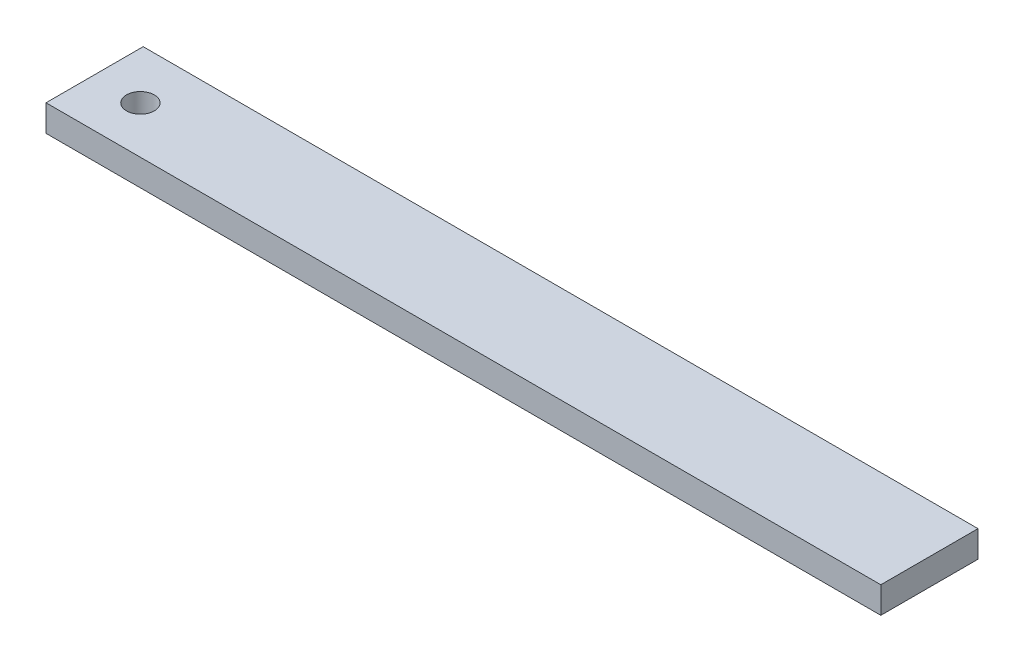
ISO-10303-21;
HEADER;
FILE_DESCRIPTION(('STEP AP214'),'2;1');
FILE_NAME('part.step','',(''),(''),'','','');
FILE_SCHEMA(('AUTOMOTIVE_DESIGN { 1 0 10303 214 1 1 1 1 }'));
ENDSEC;
DATA;
#1=APPLICATION_CONTEXT('core data for automotive mechanical design processes');
#2=APPLICATION_PROTOCOL_DEFINITION('international standard','automotive_design',2000,#1);
#3=PRODUCT_CONTEXT('',#1,'mechanical');
#4=PRODUCT('Part','Part','',(#3));
#5=PRODUCT_RELATED_PRODUCT_CATEGORY('part','',(#4));
#6=PRODUCT_DEFINITION_FORMATION('','',#4);
#7=PRODUCT_DEFINITION_CONTEXT('part definition',#1,'design');
#8=PRODUCT_DEFINITION('design','',#6,#7);
#9=PRODUCT_DEFINITION_SHAPE('','',#8);
#10=(LENGTH_UNIT() NAMED_UNIT(*) SI_UNIT(.MILLI.,.METRE.));
#11=(NAMED_UNIT(*) PLANE_ANGLE_UNIT() SI_UNIT($,.RADIAN.));
#12=(NAMED_UNIT(*) SI_UNIT($,.STERADIAN.) SOLID_ANGLE_UNIT());
#13=UNCERTAINTY_MEASURE_WITH_UNIT(LENGTH_MEASURE(1.E-05),#10,'distance_accuracy_value','');
#14=(GEOMETRIC_REPRESENTATION_CONTEXT(3) GLOBAL_UNCERTAINTY_ASSIGNED_CONTEXT((#13)) GLOBAL_UNIT_ASSIGNED_CONTEXT((#10,
#11,#12)) REPRESENTATION_CONTEXT('',''));
#15=CARTESIAN_POINT('',(0.,0.,0.));
#16=DIRECTION('',(0.,0.,1.));
#17=DIRECTION('',(1.,0.,0.));
#18=AXIS2_PLACEMENT_3D('',#15,#16,#17);
#19=CARTESIAN_POINT('',(0.,9.525,0.));
#20=DIRECTION('',(0.,1.,0.));
#21=DIRECTION('',(0.,0.,1.));
#22=AXIS2_PLACEMENT_3D('',#19,#20,#21);
#23=PLANE('',#22);
#24=DIRECTION('',(0.,0.,-1.));
#25=VECTOR('',#24,1.);
#26=CARTESIAN_POINT('',(0.,9.525,0.));
#27=LINE('',#26,#25);
#28=CARTESIAN_POINT('',(0.,9.525,0.));
#29=VERTEX_POINT('',#28);
#30=CARTESIAN_POINT('',(0.,9.525,-34.925));
#31=VERTEX_POINT('',#30);
#32=EDGE_CURVE('E88',#29,#31,#27,.T.);
#33=ORIENTED_EDGE('',*,*,#32,.T.);
#34=DIRECTION('',(-1.,0.,0.));
#35=VECTOR('',#34,1.);
#36=CARTESIAN_POINT('',(0.,9.525,-34.925));
#37=LINE('',#36,#35);
#38=CARTESIAN_POINT('',(-300.,9.525,-34.925));
#39=VERTEX_POINT('',#38);
#40=EDGE_CURVE('E83',#31,#39,#37,.T.);
#41=ORIENTED_EDGE('',*,*,#40,.T.);
#42=DIRECTION('',(0.,0.,1.));
#43=VECTOR('',#42,1.);
#44=CARTESIAN_POINT('',(-300.,9.525,0.));
#45=LINE('',#44,#43);
#46=CARTESIAN_POINT('',(-300.,9.525,0.));
#47=VERTEX_POINT('',#46);
#48=EDGE_CURVE('E86',#39,#47,#45,.T.);
#49=ORIENTED_EDGE('',*,*,#48,.T.);
#50=DIRECTION('',(1.,0.,0.));
#51=VECTOR('',#50,1.);
#52=CARTESIAN_POINT('',(0.,9.525,0.));
#53=LINE('',#52,#51);
#54=EDGE_CURVE('E53',#47,#29,#53,.T.);
#55=ORIENTED_EDGE('',*,*,#54,.T.);
#56=EDGE_LOOP('',(#33,#41,#49,#55));
#57=FACE_BOUND('',#56,.T.);
#58=CARTESIAN_POINT('',(-283.,9.525,-16.925));
#59=DIRECTION('',(0.,1.,0.));
#60=DIRECTION('',(0.,0.,1.));
#61=AXIS2_PLACEMENT_3D('',#58,#59,#60);
#62=CIRCLE('',#61,4.99999999999999);
#63=CARTESIAN_POINT('',(-283.,9.525,-21.925));
#64=VERTEX_POINT('',#63);
#65=EDGE_CURVE('E103',#64,#64,#62,.T.);
#66=ORIENTED_EDGE('',*,*,#65,.F.);
#67=EDGE_LOOP('',(#66));
#68=FACE_BOUND('',#67,.T.);
#69=ADVANCED_FACE('F36',(#57,#68),#23,.T.);
#70=CARTESIAN_POINT('',(0.,0.,0.));
#71=DIRECTION('',(0.,1.,0.));
#72=DIRECTION('',(0.,0.,1.));
#73=AXIS2_PLACEMENT_3D('',#70,#71,#72);
#74=PLANE('',#73);
#75=DIRECTION('',(0.,0.,-1.));
#76=VECTOR('',#75,1.);
#77=CARTESIAN_POINT('',(0.,0.,0.));
#78=LINE('',#77,#76);
#79=CARTESIAN_POINT('',(0.,0.,0.));
#80=VERTEX_POINT('',#79);
#81=CARTESIAN_POINT('',(0.,0.,-34.925));
#82=VERTEX_POINT('',#81);
#83=EDGE_CURVE('E100',#80,#82,#78,.T.);
#84=ORIENTED_EDGE('',*,*,#83,.F.);
#85=DIRECTION('',(1.,0.,0.));
#86=VECTOR('',#85,1.);
#87=CARTESIAN_POINT('',(0.,0.,0.));
#88=LINE('',#87,#86);
#89=CARTESIAN_POINT('',(-300.,0.,0.));
#90=VERTEX_POINT('',#89);
#91=EDGE_CURVE('E76',#90,#80,#88,.T.);
#92=ORIENTED_EDGE('',*,*,#91,.F.);
#93=DIRECTION('',(0.,0.,1.));
#94=VECTOR('',#93,1.);
#95=CARTESIAN_POINT('',(-300.,0.,0.));
#96=LINE('',#95,#94);
#97=CARTESIAN_POINT('',(-300.,0.,-34.925));
#98=VERTEX_POINT('',#97);
#99=EDGE_CURVE('E70',#98,#90,#96,.T.);
#100=ORIENTED_EDGE('',*,*,#99,.F.);
#101=DIRECTION('',(-1.,0.,0.));
#102=VECTOR('',#101,1.);
#103=CARTESIAN_POINT('',(0.,0.,-34.925));
#104=LINE('',#103,#102);
#105=EDGE_CURVE('E92',#82,#98,#104,.T.);
#106=ORIENTED_EDGE('',*,*,#105,.F.);
#107=EDGE_LOOP('',(#84,#92,#100,#106));
#108=FACE_BOUND('',#107,.T.);
#109=CARTESIAN_POINT('',(-283.,0.,-16.925));
#110=DIRECTION('',(0.,1.,0.));
#111=DIRECTION('',(0.,0.,1.));
#112=AXIS2_PLACEMENT_3D('',#109,#110,#111);
#113=CIRCLE('',#112,4.99999999999999);
#114=CARTESIAN_POINT('',(-283.,0.,-21.925));
#115=VERTEX_POINT('',#114);
#116=EDGE_CURVE('E115',#115,#115,#113,.T.);
#117=ORIENTED_EDGE('',*,*,#116,.T.);
#118=EDGE_LOOP('',(#117));
#119=FACE_BOUND('',#118,.T.);
#120=ADVANCED_FACE('F111',(#108,#119),#74,.F.);
#121=CARTESIAN_POINT('',(0.,9.525,0.));
#122=DIRECTION('',(-1.,0.,0.));
#123=DIRECTION('',(0.,0.,1.));
#124=AXIS2_PLACEMENT_3D('',#121,#122,#123);
#125=PLANE('',#124);
#126=ORIENTED_EDGE('',*,*,#83,.T.);
#127=DIRECTION('',(0.,-1.,0.));
#128=VECTOR('',#127,1.);
#129=CARTESIAN_POINT('',(0.,9.525,-34.925));
#130=LINE('',#129,#128);
#131=EDGE_CURVE('E11',#31,#82,#130,.T.);
#132=ORIENTED_EDGE('',*,*,#131,.F.);
#133=ORIENTED_EDGE('',*,*,#32,.F.);
#134=DIRECTION('',(0.,-1.,0.));
#135=VECTOR('',#134,1.);
#136=CARTESIAN_POINT('',(0.,9.525,0.));
#137=LINE('',#136,#135);
#138=EDGE_CURVE('E96',#29,#80,#137,.T.);
#139=ORIENTED_EDGE('',*,*,#138,.T.);
#140=EDGE_LOOP('',(#126,#132,#133,#139));
#141=FACE_BOUND('',#140,.T.);
#142=ADVANCED_FACE('F38',(#141),#125,.F.);
#143=CARTESIAN_POINT('',(0.,9.525,-34.925));
#144=DIRECTION('',(0.,0.,1.));
#145=DIRECTION('',(1.,0.,0.));
#146=AXIS2_PLACEMENT_3D('',#143,#144,#145);
#147=PLANE('',#146);
#148=ORIENTED_EDGE('',*,*,#105,.T.);
#149=DIRECTION('',(0.,-1.,0.));
#150=VECTOR('',#149,1.);
#151=CARTESIAN_POINT('',(-300.,9.525,-34.925));
#152=LINE('',#151,#150);
#153=EDGE_CURVE('E45',#39,#98,#152,.T.);
#154=ORIENTED_EDGE('',*,*,#153,.F.);
#155=ORIENTED_EDGE('',*,*,#40,.F.);
#156=ORIENTED_EDGE('',*,*,#131,.T.);
#157=EDGE_LOOP('',(#148,#154,#155,#156));
#158=FACE_BOUND('',#157,.T.);
#159=ADVANCED_FACE('F91',(#158),#147,.F.);
#160=CARTESIAN_POINT('',(-300.,9.525,0.));
#161=DIRECTION('',(1.,0.,0.));
#162=DIRECTION('',(0.,0.,-1.));
#163=AXIS2_PLACEMENT_3D('',#160,#161,#162);
#164=PLANE('',#163);
#165=ORIENTED_EDGE('',*,*,#99,.T.);
#166=DIRECTION('',(0.,-1.,0.));
#167=VECTOR('',#166,1.);
#168=CARTESIAN_POINT('',(-300.,9.525,0.));
#169=LINE('',#168,#167);
#170=EDGE_CURVE('E93',#47,#90,#169,.T.);
#171=ORIENTED_EDGE('',*,*,#170,.F.);
#172=ORIENTED_EDGE('',*,*,#48,.F.);
#173=ORIENTED_EDGE('',*,*,#153,.T.);
#174=EDGE_LOOP('',(#165,#171,#172,#173));
#175=FACE_BOUND('',#174,.T.);
#176=ADVANCED_FACE('F94',(#175),#164,.F.);
#177=CARTESIAN_POINT('',(0.,9.525,0.));
#178=DIRECTION('',(0.,0.,-1.));
#179=DIRECTION('',(-1.,0.,0.));
#180=AXIS2_PLACEMENT_3D('',#177,#178,#179);
#181=PLANE('',#180);
#182=ORIENTED_EDGE('',*,*,#91,.T.);
#183=ORIENTED_EDGE('',*,*,#138,.F.);
#184=ORIENTED_EDGE('',*,*,#54,.F.);
#185=ORIENTED_EDGE('',*,*,#170,.T.);
#186=EDGE_LOOP('',(#182,#183,#184,#185));
#187=FACE_BOUND('',#186,.T.);
#188=ADVANCED_FACE('F108',(#187),#181,.F.);
#189=CARTESIAN_POINT('',(-283.,9.525,-16.925));
#190=DIRECTION('',(0.,-1.,0.));
#191=DIRECTION('',(0.,0.,-1.));
#192=AXIS2_PLACEMENT_3D('',#189,#190,#191);
#193=CYLINDRICAL_SURFACE('',#192,4.99999999999999);
#194=CARTESIAN_POINT('',(-283.,9.525,-21.925));
#195=CARTESIAN_POINT('',(-283.,9.42578125,-21.925));
#196=CARTESIAN_POINT('',(-283.,9.3265625,-21.925));
#197=CARTESIAN_POINT('',(-283.,9.128125,-21.925));
#198=CARTESIAN_POINT('',(-283.,9.02890625,-21.925));
#199=CARTESIAN_POINT('',(-283.,8.83046875,-21.925));
#200=CARTESIAN_POINT('',(-283.,8.73125,-21.925));
#201=CARTESIAN_POINT('',(-283.,8.5328125,-21.925));
#202=CARTESIAN_POINT('',(-283.,8.43359375,-21.925));
#203=CARTESIAN_POINT('',(-283.,8.23515625,-21.925));
#204=CARTESIAN_POINT('',(-283.,8.1359375,-21.925));
#205=CARTESIAN_POINT('',(-283.,7.9375,-21.925));
#206=CARTESIAN_POINT('',(-283.,7.83828125,-21.925));
#207=CARTESIAN_POINT('',(-283.,7.63984375,-21.925));
#208=CARTESIAN_POINT('',(-283.,7.540625,-21.925));
#209=CARTESIAN_POINT('',(-283.,7.3421875,-21.925));
#210=CARTESIAN_POINT('',(-283.,7.24296875,-21.925));
#211=CARTESIAN_POINT('',(-283.,7.04453125,-21.925));
#212=CARTESIAN_POINT('',(-283.,6.9453125,-21.925));
#213=CARTESIAN_POINT('',(-283.,6.746875,-21.925));
#214=CARTESIAN_POINT('',(-283.,6.64765625,-21.925));
#215=CARTESIAN_POINT('',(-283.,6.44921875,-21.925));
#216=CARTESIAN_POINT('',(-283.,6.35,-21.925));
#217=CARTESIAN_POINT('',(-283.,6.1515625,-21.925));
#218=CARTESIAN_POINT('',(-283.,6.05234375,-21.925));
#219=CARTESIAN_POINT('',(-283.,5.85390625,-21.925));
#220=CARTESIAN_POINT('',(-283.,5.7546875,-21.925));
#221=CARTESIAN_POINT('',(-283.,5.55625,-21.925));
#222=CARTESIAN_POINT('',(-283.,5.45703125,-21.925));
#223=CARTESIAN_POINT('',(-283.,5.25859375,-21.925));
#224=CARTESIAN_POINT('',(-283.,5.159375,-21.925));
#225=CARTESIAN_POINT('',(-283.,4.9609375,-21.925));
#226=CARTESIAN_POINT('',(-283.,4.86171875,-21.925));
#227=CARTESIAN_POINT('',(-283.,4.66328125,-21.925));
#228=CARTESIAN_POINT('',(-283.,4.5640625,-21.925));
#229=CARTESIAN_POINT('',(-283.,4.365625,-21.925));
#230=CARTESIAN_POINT('',(-283.,4.26640625,-21.925));
#231=CARTESIAN_POINT('',(-283.,4.06796875,-21.925));
#232=CARTESIAN_POINT('',(-283.,3.96875,-21.925));
#233=CARTESIAN_POINT('',(-283.,3.7703125,-21.925));
#234=CARTESIAN_POINT('',(-283.,3.67109375,-21.925));
#235=CARTESIAN_POINT('',(-283.,3.47265625,-21.925));
#236=CARTESIAN_POINT('',(-283.,3.3734375,-21.925));
#237=CARTESIAN_POINT('',(-283.,3.175,-21.925));
#238=CARTESIAN_POINT('',(-283.,3.07578125,-21.925));
#239=CARTESIAN_POINT('',(-283.,2.87734375,-21.925));
#240=CARTESIAN_POINT('',(-283.,2.778125,-21.925));
#241=CARTESIAN_POINT('',(-283.,2.5796875,-21.925));
#242=CARTESIAN_POINT('',(-283.,2.48046875,-21.925));
#243=CARTESIAN_POINT('',(-283.,2.28203125,-21.925));
#244=CARTESIAN_POINT('',(-283.,2.1828125,-21.925));
#245=CARTESIAN_POINT('',(-283.,1.984375,-21.925));
#246=CARTESIAN_POINT('',(-283.,1.88515625,-21.925));
#247=CARTESIAN_POINT('',(-283.,1.68671875,-21.925));
#248=CARTESIAN_POINT('',(-283.,1.5875,-21.925));
#249=CARTESIAN_POINT('',(-283.,1.3890625,-21.925));
#250=CARTESIAN_POINT('',(-283.,1.28984375,-21.925));
#251=CARTESIAN_POINT('',(-283.,1.09140625,-21.925));
#252=CARTESIAN_POINT('',(-283.,0.992187500000001,-21.925));
#253=CARTESIAN_POINT('',(-283.,0.793750000000001,-21.925));
#254=CARTESIAN_POINT('',(-283.,0.69453125,-21.925));
#255=CARTESIAN_POINT('',(-283.,0.49609375,-21.925));
#256=CARTESIAN_POINT('',(-283.,0.396875,-21.925));
#257=CARTESIAN_POINT('',(-283.,0.1984375,-21.925));
#258=CARTESIAN_POINT('',(-283.,0.0992187500000001,-21.925));
#259=CARTESIAN_POINT('',(-283.,0.,-21.925));
#260=B_SPLINE_CURVE_WITH_KNOTS('',3,(#194,#195,#196,#197,#198,#199,#200,#201,#202,#203,#204,
#205,#206,#207,#208,#209,#210,#211,#212,#213,#214,#215,#216,#217,#218,#219,#220,#221,#222,#223,
#224,#225,#226,#227,#228,#229,#230,#231,#232,#233,#234,#235,#236,#237,#238,#239,#240,#241,#242,
#243,#244,#245,#246,#247,#248,#249,#250,#251,#252,#253,#254,#255,#256,#257,#258,#259),
.UNSPECIFIED.,.F.,.F.,(4,2,2,2,2,2,2,2,2,2,2,2,2,2,2,2,2,2,2,2,2,2,2,2,2,2,2,2,2,2,2,2,4),(0.,
0.29765625,0.5953125,0.892968750000001,1.190625,1.48828125,1.7859375,2.08359375,2.38125,
2.67890625,2.9765625,3.27421875,3.571875,3.86953125,4.1671875,4.46484375,4.7625,5.06015625,
5.3578125,5.65546875,5.953125,6.25078125,6.5484375,6.84609375,7.14375,7.44140625,7.7390625,
8.03671875,8.334375,8.63203125,8.9296875,9.22734375,9.525),.UNSPECIFIED.);
#261=EDGE_CURVE('BSEAM121',#64,#115,#260,.T.);
#262=ORIENTED_EDGE('',*,*,#65,.T.);
#263=ORIENTED_EDGE('',*,*,#116,.F.);
#264=ORIENTED_EDGE('',*,*,#261,.T.);
#265=ORIENTED_EDGE('',*,*,#261,.F.);
#266=EDGE_LOOP('',(#262,#264,#263,#265));
#267=FACE_BOUND('',#266,.T.);
#268=ADVANCED_FACE('F121',(#267),#193,.F.);
#269=CLOSED_SHELL('',(#69,#120,#142,#159,#176,#188,#268));
#270=MANIFOLD_SOLID_BREP('B2',#269);
#271=ADVANCED_BREP_SHAPE_REPRESENTATION('',(#18,#270),#14);
#272=SHAPE_DEFINITION_REPRESENTATION(#9,#271);
ENDSEC;
END-ISO-10303-21;
